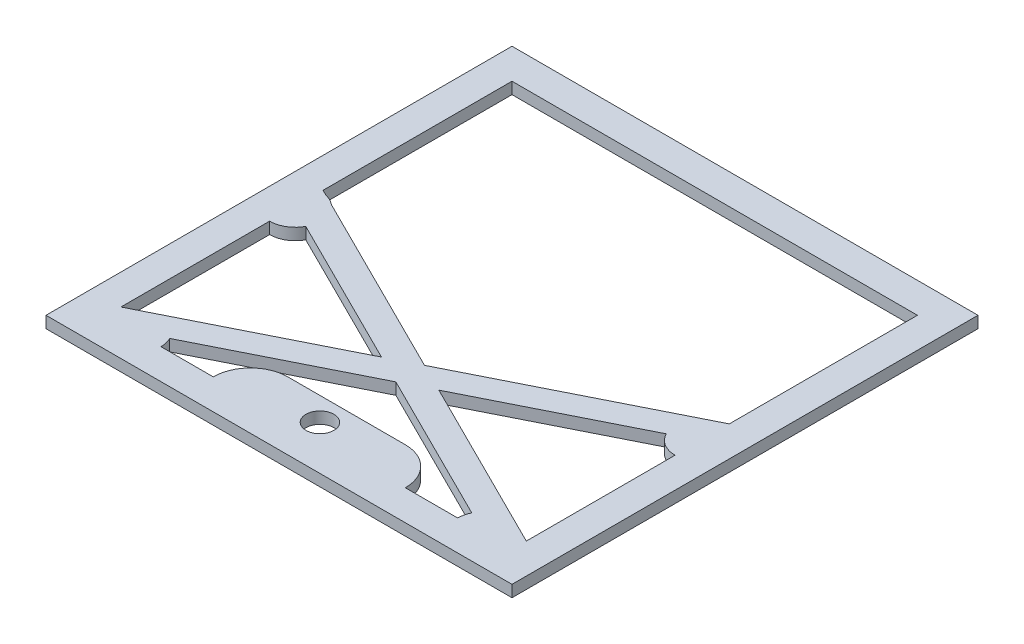
ISO-10303-21;
HEADER;
FILE_DESCRIPTION(('STEP AP214'),'2;1');
FILE_NAME('part.step','',(''),(''),'','','');
FILE_SCHEMA(('AUTOMOTIVE_DESIGN { 1 0 10303 214 1 1 1 1 }'));
ENDSEC;
DATA;
#1=APPLICATION_CONTEXT('core data for automotive mechanical design processes');
#2=APPLICATION_PROTOCOL_DEFINITION('international standard','automotive_design',2000,#1);
#3=PRODUCT_CONTEXT('',#1,'mechanical');
#4=PRODUCT('Part','Part','',(#3));
#5=PRODUCT_RELATED_PRODUCT_CATEGORY('part','',(#4));
#6=PRODUCT_DEFINITION_FORMATION('','',#4);
#7=PRODUCT_DEFINITION_CONTEXT('part definition',#1,'design');
#8=PRODUCT_DEFINITION('design','',#6,#7);
#9=PRODUCT_DEFINITION_SHAPE('','',#8);
#10=(LENGTH_UNIT() NAMED_UNIT(*) SI_UNIT(.MILLI.,.METRE.));
#11=(NAMED_UNIT(*) PLANE_ANGLE_UNIT() SI_UNIT($,.RADIAN.));
#12=(NAMED_UNIT(*) SI_UNIT($,.STERADIAN.) SOLID_ANGLE_UNIT());
#13=UNCERTAINTY_MEASURE_WITH_UNIT(LENGTH_MEASURE(1.E-05),#10,'distance_accuracy_value','');
#14=(GEOMETRIC_REPRESENTATION_CONTEXT(3) GLOBAL_UNCERTAINTY_ASSIGNED_CONTEXT((#13)) GLOBAL_UNIT_ASSIGNED_CONTEXT((#10,
#11,#12)) REPRESENTATION_CONTEXT('',''));
#15=CARTESIAN_POINT('',(0.,0.,0.));
#16=DIRECTION('',(0.,0.,1.));
#17=DIRECTION('',(1.,0.,0.));
#18=AXIS2_PLACEMENT_3D('',#15,#16,#17);
#19=CARTESIAN_POINT('',(44.7272034323035,0.,41.0390100090121));
#20=DIRECTION('',(0.446255793564874,0.,-0.894905451268336));
#21=DIRECTION('',(-0.894905451268336,0.,-0.446255793564874));
#22=AXIS2_PLACEMENT_3D('',#19,#20,#21);
#23=PLANE('',#22);
#24=DIRECTION('',(0.,1.,0.));
#25=VECTOR('',#24,1.);
#26=CARTESIAN_POINT('',(-42.2661730507299,0.,-2.34132497755329));
#27=LINE('',#26,#25);
#28=CARTESIAN_POINT('',(-42.2661730507299,0.,-2.34132497755329));
#29=VERTEX_POINT('',#28);
#30=CARTESIAN_POINT('',(-42.2661730507299,2.5,-2.3413249775533));
#31=VERTEX_POINT('',#30);
#32=EDGE_CURVE('E12',#29,#31,#27,.T.);
#33=ORIENTED_EDGE('',*,*,#32,.F.);
#34=DIRECTION('',(-0.894905451268336,0.,-0.446255793564874));
#35=VECTOR('',#34,1.);
#36=CARTESIAN_POINT('',(44.7272034323035,0.,41.0390100090121));
#37=LINE('',#36,#35);
#38=CARTESIAN_POINT('',(-43.5000000000001,0.,-2.95658821411972));
#39=VERTEX_POINT('',#38);
#40=EDGE_CURVE('E292',#29,#39,#37,.T.);
#41=ORIENTED_EDGE('',*,*,#40,.T.);
#42=DIRECTION('',(0.,1.,0.));
#43=VECTOR('',#42,1.);
#44=CARTESIAN_POINT('',(-43.5000000000001,2.5,-2.95658821411972));
#45=LINE('',#44,#43);
#46=CARTESIAN_POINT('',(-43.5000000000001,2.5,-2.95658821411972));
#47=VERTEX_POINT('',#46);
#48=EDGE_CURVE('E449',#39,#47,#45,.T.);
#49=ORIENTED_EDGE('',*,*,#48,.T.);
#50=DIRECTION('',(-0.894905451268336,0.,-0.446255793564874));
#51=VECTOR('',#50,1.);
#52=CARTESIAN_POINT('',(44.7272034323035,2.5,41.0390100090121));
#53=LINE('',#52,#51);
#54=EDGE_CURVE('E278',#31,#47,#53,.T.);
#55=ORIENTED_EDGE('',*,*,#54,.F.);
#56=EDGE_LOOP('',(#33,#41,#49,#55));
#57=FACE_BOUND('',#56,.T.);
#58=ADVANCED_FACE('F67',(#57),#23,.T.);
#59=CARTESIAN_POINT('',(43.5000000000001,2.5,43.5));
#60=DIRECTION('',(-1.,0.,0.));
#61=DIRECTION('',(0.,0.,1.));
#62=AXIS2_PLACEMENT_3D('',#59,#60,#61);
#63=PLANE('',#62);
#64=DIRECTION('',(0.,0.,-1.));
#65=VECTOR('',#64,1.);
#66=CARTESIAN_POINT('',(43.5000000000001,0.,43.5));
#67=LINE('',#66,#65);
#68=CARTESIAN_POINT('',(43.5000000000001,0.,-3.13230147297346));
#69=VERTEX_POINT('',#68);
#70=CARTESIAN_POINT('',(43.5000000000001,0.,-43.5));
#71=VERTEX_POINT('',#70);
#72=EDGE_CURVE('E357',#69,#71,#67,.T.);
#73=ORIENTED_EDGE('',*,*,#72,.F.);
#74=DIRECTION('',(0.,1.,0.));
#75=VECTOR('',#74,1.);
#76=CARTESIAN_POINT('',(43.5000000000001,2.5,-3.13230147297346));
#77=LINE('',#76,#75);
#78=CARTESIAN_POINT('',(43.5000000000001,2.5,-3.13230147297346));
#79=VERTEX_POINT('',#78);
#80=EDGE_CURVE('E459',#69,#79,#77,.T.);
#81=ORIENTED_EDGE('',*,*,#80,.T.);
#82=DIRECTION('',(0.,0.,-1.));
#83=VECTOR('',#82,1.);
#84=CARTESIAN_POINT('',(43.5000000000001,2.5,43.5));
#85=LINE('',#84,#83);
#86=CARTESIAN_POINT('',(43.5000000000001,2.5,-43.5));
#87=VERTEX_POINT('',#86);
#88=EDGE_CURVE('E361',#79,#87,#85,.T.);
#89=ORIENTED_EDGE('',*,*,#88,.T.);
#90=DIRECTION('',(0.,-1.,0.));
#91=VECTOR('',#90,1.);
#92=CARTESIAN_POINT('',(43.5000000000001,2.5,-43.5));
#93=LINE('',#92,#91);
#94=EDGE_CURVE('E395',#87,#71,#93,.T.);
#95=ORIENTED_EDGE('',*,*,#94,.T.);
#96=EDGE_LOOP('',(#73,#81,#89,#95));
#97=FACE_BOUND('',#96,.T.);
#98=ADVANCED_FACE('F535',(#97),#63,.T.);
#99=CARTESIAN_POINT('',(-43.5000000000001,2.5,43.5));
#100=DIRECTION('',(1.,0.,0.));
#101=DIRECTION('',(0.,0.,-1.));
#102=AXIS2_PLACEMENT_3D('',#99,#100,#101);
#103=PLANE('',#102);
#104=DIRECTION('',(0.,1.,0.));
#105=VECTOR('',#104,1.);
#106=CARTESIAN_POINT('',(-43.5000000000001,0.,8.51849508092393));
#107=LINE('',#106,#105);
#108=CARTESIAN_POINT('',(-43.5000000000001,2.5,8.51849508092393));
#109=VERTEX_POINT('',#108);
#110=CARTESIAN_POINT('',(-43.5000000000001,0.,8.51849508092393));
#111=VERTEX_POINT('',#110);
#112=EDGE_CURVE('E83',#109,#111,#107,.F.);
#113=ORIENTED_EDGE('',*,*,#112,.F.);
#114=DIRECTION('',(0.,0.,1.));
#115=VECTOR('',#114,1.);
#116=CARTESIAN_POINT('',(-43.5000000000001,2.5,43.5));
#117=LINE('',#116,#115);
#118=CARTESIAN_POINT('',(-43.5000000000001,2.5,40.4246017230513));
#119=VERTEX_POINT('',#118);
#120=EDGE_CURVE('E369',#109,#119,#117,.T.);
#121=ORIENTED_EDGE('',*,*,#120,.T.);
#122=DIRECTION('',(0.,-1.,0.));
#123=VECTOR('',#122,1.);
#124=CARTESIAN_POINT('',(-43.5000000000001,2.5,40.4246017230513));
#125=LINE('',#124,#123);
#126=CARTESIAN_POINT('',(-43.5000000000001,0.,40.4246017230513));
#127=VERTEX_POINT('',#126);
#128=EDGE_CURVE('E453',#119,#127,#125,.T.);
#129=ORIENTED_EDGE('',*,*,#128,.T.);
#130=DIRECTION('',(0.,0.,1.));
#131=VECTOR('',#130,1.);
#132=CARTESIAN_POINT('',(-43.5000000000001,0.,43.5));
#133=LINE('',#132,#131);
#134=EDGE_CURVE('E88',#111,#127,#133,.T.);
#135=ORIENTED_EDGE('',*,*,#134,.F.);
#136=EDGE_LOOP('',(#113,#121,#129,#135));
#137=FACE_BOUND('',#136,.T.);
#138=ADVANCED_FACE('F635',(#137),#103,.T.);
#139=CARTESIAN_POINT('',(-43.5000000000001,2.5,43.5));
#140=DIRECTION('',(0.,0.,-1.));
#141=DIRECTION('',(-1.,0.,0.));
#142=AXIS2_PLACEMENT_3D('',#139,#140,#141);
#143=PLANE('',#142);
#144=DIRECTION('',(0.,1.,0.));
#145=VECTOR('',#144,1.);
#146=CARTESIAN_POINT('',(31.8376150188844,0.,43.5));
#147=LINE('',#146,#145);
#148=CARTESIAN_POINT('',(31.8376150188844,0.,43.5));
#149=VERTEX_POINT('',#148);
#150=CARTESIAN_POINT('',(31.8376150188844,2.5,43.5));
#151=VERTEX_POINT('',#150);
#152=EDGE_CURVE('E283',#149,#151,#147,.T.);
#153=ORIENTED_EDGE('',*,*,#152,.F.);
#154=DIRECTION('',(1.,0.,0.));
#155=VECTOR('',#154,1.);
#156=CARTESIAN_POINT('',(-43.5000000000001,0.,43.5));
#157=LINE('',#156,#155);
#158=CARTESIAN_POINT('',(20.6151371181737,0.,43.5));
#159=VERTEX_POINT('',#158);
#160=EDGE_CURVE('E390',#159,#149,#157,.T.);
#161=ORIENTED_EDGE('',*,*,#160,.F.);
#162=DIRECTION('',(0.,1.,0.));
#163=VECTOR('',#162,1.);
#164=CARTESIAN_POINT('',(20.6151371181737,0.,43.5));
#165=LINE('',#164,#163);
#166=CARTESIAN_POINT('',(20.6151371181737,2.5,43.5));
#167=VERTEX_POINT('',#166);
#168=EDGE_CURVE('E441',#167,#159,#165,.F.);
#169=ORIENTED_EDGE('',*,*,#168,.F.);
#170=DIRECTION('',(1.,0.,0.));
#171=VECTOR('',#170,1.);
#172=CARTESIAN_POINT('',(-43.5000000000001,2.5,43.5));
#173=LINE('',#172,#171);
#174=EDGE_CURVE('E374',#167,#151,#173,.T.);
#175=ORIENTED_EDGE('',*,*,#174,.T.);
#176=EDGE_LOOP('',(#153,#161,#169,#175));
#177=FACE_BOUND('',#176,.T.);
#178=ADVANCED_FACE('F587',(#177),#143,.T.);
#179=DIRECTION('',(0.,1.,0.));
#180=VECTOR('',#179,1.);
#181=CARTESIAN_POINT('',(-31.8376150188844,0.,43.5));
#182=LINE('',#181,#180);
#183=CARTESIAN_POINT('',(-31.8376150188844,2.5,43.5));
#184=VERTEX_POINT('',#183);
#185=CARTESIAN_POINT('',(-31.8376150188844,0.,43.5));
#186=VERTEX_POINT('',#185);
#187=EDGE_CURVE('E569',#184,#186,#182,.F.);
#188=ORIENTED_EDGE('',*,*,#187,.F.);
#189=CARTESIAN_POINT('',(-20.6151371181738,2.5,43.5));
#190=VERTEX_POINT('',#189);
#191=EDGE_CURVE('E375',#184,#190,#173,.T.);
#192=ORIENTED_EDGE('',*,*,#191,.T.);
#193=DIRECTION('',(0.,1.,0.));
#194=VECTOR('',#193,1.);
#195=CARTESIAN_POINT('',(-20.6151371181738,0.,43.5));
#196=LINE('',#195,#194);
#197=CARTESIAN_POINT('',(-20.6151371181738,0.,43.5));
#198=VERTEX_POINT('',#197);
#199=EDGE_CURVE('E445',#198,#190,#196,.T.);
#200=ORIENTED_EDGE('',*,*,#199,.F.);
#201=EDGE_CURVE('E365',#186,#198,#157,.T.);
#202=ORIENTED_EDGE('',*,*,#201,.F.);
#203=EDGE_LOOP('',(#188,#192,#200,#202));
#204=FACE_BOUND('',#203,.T.);
#205=ADVANCED_FACE('F601',(#204),#143,.T.);
#206=CARTESIAN_POINT('',(0.,2.5,0.));
#207=DIRECTION('',(0.,-1.,0.));
#208=DIRECTION('',(0.,0.,-1.));
#209=AXIS2_PLACEMENT_3D('',#206,#207,#208);
#210=PLANE('',#209);
#211=ORIENTED_EDGE('',*,*,#120,.F.);
#212=CARTESIAN_POINT('',(-43.5000000000001,2.5,3.01849508092393));
#213=DIRECTION('',(0.,1.,0.));
#214=DIRECTION('',(0.,0.,-1.));
#215=AXIS2_PLACEMENT_3D('',#212,#213,#214);
#216=CIRCLE('',#215,5.5);
#217=CARTESIAN_POINT('',(-38.6481385406084,2.5,5.60875382839877));
#218=VERTEX_POINT('',#217);
#219=EDGE_CURVE('E258',#109,#218,#216,.T.);
#220=ORIENTED_EDGE('',*,*,#219,.T.);
#221=DIRECTION('',(-0.894905451268336,0.,-0.446255793564874));
#222=VECTOR('',#221,1.);
#223=CARTESIAN_POINT('',(42.2727965676967,2.5,45.9609899909879));
#224=LINE('',#223,#222);
#225=CARTESIAN_POINT('',(-6.23924538378793,2.5,21.7698536560492));
#226=VERTEX_POINT('',#225);
#227=EDGE_CURVE('E282',#226,#218,#224,.T.);
#228=ORIENTED_EDGE('',*,*,#227,.F.);
#229=DIRECTION('',(0.894193126338244,0.,-0.447681418878914));
#230=VECTOR('',#229,1.);
#231=CARTESIAN_POINT('',(-44.7311239019171,2.5,41.0409689025698));
#232=LINE('',#231,#230);
#233=EDGE_CURVE('E321',#119,#226,#232,.T.);
#234=ORIENTED_EDGE('',*,*,#233,.F.);
#235=EDGE_LOOP('',(#211,#220,#228,#234));
#236=FACE_BOUND('',#235,.T.);
#237=ORIENTED_EDGE('',*,*,#191,.F.);
#238=CARTESIAN_POINT('',(-37.3376150188845,2.5,43.5));
#239=DIRECTION('',(0.,1.,0.));
#240=DIRECTION('',(0.,0.,-1.));
#241=AXIS2_PLACEMENT_3D('',#238,#239,#240);
#242=CIRCLE('',#241,5.50000000000001);
#243=CARTESIAN_POINT('',(-32.4234920921566,2.5,41.0298996253172));
#244=VERTEX_POINT('',#243);
#245=EDGE_CURVE('E473',#184,#244,#242,.T.);
#246=ORIENTED_EDGE('',*,*,#245,.T.);
#247=DIRECTION('',(0.894193126338244,0.,-0.447681418878914));
#248=VECTOR('',#247,1.);
#249=CARTESIAN_POINT('',(-42.2688760980831,2.5,45.9590310974302));
#250=LINE('',#249,#248);
#251=CARTESIAN_POINT('',(-0.0842422801904177,2.5,24.8391229185141));
#252=VERTEX_POINT('',#251);
#253=EDGE_CURVE('E318',#244,#252,#250,.T.);
#254=ORIENTED_EDGE('',*,*,#253,.T.);
#255=CARTESIAN_POINT('',(32.4156350369086,2.5,41.0455931353932));
#256=VERTEX_POINT('',#255);
#257=EDGE_CURVE('E288',#256,#252,#224,.T.);
#258=ORIENTED_EDGE('',*,*,#257,.F.);
#259=CARTESIAN_POINT('',(37.3376150188845,2.5,43.5));
#260=DIRECTION('',(0.,1.,0.));
#261=DIRECTION('',(0.,0.,1.));
#262=AXIS2_PLACEMENT_3D('',#259,#260,#261);
#263=CIRCLE('',#262,5.50000000000001);
#264=EDGE_CURVE('E494',#256,#151,#263,.T.);
#265=ORIENTED_EDGE('',*,*,#264,.T.);
#266=ORIENTED_EDGE('',*,*,#174,.F.);
#267=CARTESIAN_POINT('',(12.6151371181737,2.5,43.5));
#268=DIRECTION('',(0.,1.,0.));
#269=DIRECTION('',(0.,0.,1.));
#270=AXIS2_PLACEMENT_3D('',#267,#268,#269);
#271=CIRCLE('',#270,8.);
#272=CARTESIAN_POINT('',(12.6151371181738,2.5,35.5));
#273=VERTEX_POINT('',#272);
#274=EDGE_CURVE('E348',#167,#273,#271,.T.);
#275=ORIENTED_EDGE('',*,*,#274,.T.);
#276=DIRECTION('',(-1.,0.,0.));
#277=VECTOR('',#276,1.);
#278=CARTESIAN_POINT('',(-12.6151371181738,2.5,35.5));
#279=LINE('',#278,#277);
#280=CARTESIAN_POINT('',(-12.6151371181738,2.5,35.5));
#281=VERTEX_POINT('',#280);
#282=EDGE_CURVE('E337',#273,#281,#279,.T.);
#283=ORIENTED_EDGE('',*,*,#282,.T.);
#284=CARTESIAN_POINT('',(-12.6151371181738,2.5,43.5));
#285=DIRECTION('',(0.,1.,0.));
#286=DIRECTION('',(0.,0.,1.));
#287=AXIS2_PLACEMENT_3D('',#284,#285,#286);
#288=CIRCLE('',#287,8.);
#289=EDGE_CURVE('E328',#281,#190,#288,.T.);
#290=ORIENTED_EDGE('',*,*,#289,.T.);
#291=EDGE_LOOP('',(#237,#246,#254,#258,#265,#266,#275,#283,#290));
#292=FACE_BOUND('',#291,.T.);
#293=CARTESIAN_POINT('',(6.06586157718027,2.5,21.7600484545946));
#294=VERTEX_POINT('',#293);
#295=CARTESIAN_POINT('',(38.5819378051397,2.5,5.48074288475796));
#296=VERTEX_POINT('',#295);
#297=EDGE_CURVE('E308',#294,#296,#250,.T.);
#298=ORIENTED_EDGE('',*,*,#297,.T.);
#299=CARTESIAN_POINT('',(43.5000000000001,2.5,3.01849508092393));
#300=DIRECTION('',(0.,1.,0.));
#301=DIRECTION('',(0.,0.,1.));
#302=AXIS2_PLACEMENT_3D('',#299,#300,#301);
#303=CIRCLE('',#302,5.5);
#304=CARTESIAN_POINT('',(43.5000000000001,2.5,8.51849508092393));
#305=VERTEX_POINT('',#304);
#306=EDGE_CURVE('E568',#296,#305,#303,.T.);
#307=ORIENTED_EDGE('',*,*,#306,.T.);
#308=CARTESIAN_POINT('',(43.5000000000001,2.5,40.4270496720045));
#309=VERTEX_POINT('',#308);
#310=EDGE_CURVE('E364',#309,#305,#85,.T.);
#311=ORIENTED_EDGE('',*,*,#310,.F.);
#312=EDGE_CURVE('E277',#309,#294,#53,.T.);
#313=ORIENTED_EDGE('',*,*,#312,.T.);
#314=EDGE_LOOP('',(#298,#307,#311,#313));
#315=FACE_BOUND('',#314,.T.);
#316=CARTESIAN_POINT('',(-0.0891415264172302,2.5,18.6907791921297));
#317=VERTEX_POINT('',#316);
#318=CARTESIAN_POINT('',(-39.9614473496563,2.5,-1.19204468741283));
#319=VERTEX_POINT('',#318);
#320=EDGE_CURVE('E266',#317,#319,#53,.T.);
#321=ORIENTED_EDGE('',*,*,#320,.T.);
#322=EDGE_CURVE('E249',#319,#31,#216,.T.);
#323=ORIENTED_EDGE('',*,*,#322,.T.);
#324=ORIENTED_EDGE('',*,*,#54,.T.);
#325=CARTESIAN_POINT('',(-43.5000000000001,2.5,-43.5));
#326=VERTEX_POINT('',#325);
#327=EDGE_CURVE('E370',#326,#47,#117,.T.);
#328=ORIENTED_EDGE('',*,*,#327,.F.);
#329=DIRECTION('',(-1.,0.,0.));
#330=VECTOR('',#329,1.);
#331=CARTESIAN_POINT('',(-43.5000000000001,2.5,-43.5));
#332=LINE('',#331,#330);
#333=EDGE_CURVE('E366',#87,#326,#332,.T.);
#334=ORIENTED_EDGE('',*,*,#333,.F.);
#335=ORIENTED_EDGE('',*,*,#88,.F.);
#336=EDGE_CURVE('E274',#317,#79,#232,.T.);
#337=ORIENTED_EDGE('',*,*,#336,.F.);
#338=EDGE_LOOP('',(#321,#323,#324,#328,#334,#335,#337));
#339=FACE_BOUND('',#338,.T.);
#340=DIRECTION('',(1.,0.,0.));
#341=VECTOR('',#340,1.);
#342=CARTESIAN_POINT('',(-50.,2.5,50.));
#343=LINE('',#342,#341);
#344=CARTESIAN_POINT('',(-50.,2.5,50.));
#345=VERTEX_POINT('',#344);
#346=CARTESIAN_POINT('',(50.,2.5,50.));
#347=VERTEX_POINT('',#346);
#348=EDGE_CURVE('E411',#345,#347,#343,.T.);
#349=ORIENTED_EDGE('',*,*,#348,.T.);
#350=DIRECTION('',(0.,0.,-1.));
#351=VECTOR('',#350,1.);
#352=CARTESIAN_POINT('',(50.,2.5,50.));
#353=LINE('',#352,#351);
#354=CARTESIAN_POINT('',(50.,2.5,-50.));
#355=VERTEX_POINT('',#354);
#356=EDGE_CURVE('E400',#347,#355,#353,.T.);
#357=ORIENTED_EDGE('',*,*,#356,.T.);
#358=DIRECTION('',(-1.,0.,0.));
#359=VECTOR('',#358,1.);
#360=CARTESIAN_POINT('',(-50.,2.5,-50.));
#361=LINE('',#360,#359);
#362=CARTESIAN_POINT('',(-50.,2.5,-50.));
#363=VERTEX_POINT('',#362);
#364=EDGE_CURVE('E404',#355,#363,#361,.T.);
#365=ORIENTED_EDGE('',*,*,#364,.T.);
#366=DIRECTION('',(0.,0.,1.));
#367=VECTOR('',#366,1.);
#368=CARTESIAN_POINT('',(-50.,2.5,50.));
#369=LINE('',#368,#367);
#370=EDGE_CURVE('E408',#363,#345,#369,.T.);
#371=ORIENTED_EDGE('',*,*,#370,.T.);
#372=EDGE_LOOP('',(#349,#357,#365,#371));
#373=FACE_BOUND('',#372,.T.);
#374=CARTESIAN_POINT('',(-0.710916126079611,2.5,40.5));
#375=DIRECTION('',(0.,1.,0.));
#376=DIRECTION('',(0.,0.,1.));
#377=AXIS2_PLACEMENT_3D('',#374,#375,#376);
#378=CIRCLE('',#377,3.);
#379=CARTESIAN_POINT('',(-0.710916126079611,2.5,43.5));
#380=VERTEX_POINT('',#379);
#381=EDGE_CURVE('E317',#380,#380,#378,.T.);
#382=ORIENTED_EDGE('',*,*,#381,.F.);
#383=EDGE_LOOP('',(#382));
#384=FACE_BOUND('',#383,.T.);
#385=ADVANCED_FACE('F271',(#236,#292,#315,#339,#373,#384),#210,.F.);
#386=CARTESIAN_POINT('',(0.,0.,0.));
#387=DIRECTION('',(0.,-1.,0.));
#388=DIRECTION('',(0.,0.,-1.));
#389=AXIS2_PLACEMENT_3D('',#386,#387,#388);
#390=PLANE('',#389);
#391=CARTESIAN_POINT('',(-43.5000000000001,0.,3.01849508092393));
#392=DIRECTION('',(0.,1.,0.));
#393=DIRECTION('',(0.,0.,-1.));
#394=AXIS2_PLACEMENT_3D('',#391,#392,#393);
#395=CIRCLE('',#394,5.5);
#396=CARTESIAN_POINT('',(-38.6481385406084,0.,5.60875382839877));
#397=VERTEX_POINT('',#396);
#398=EDGE_CURVE('E259',#111,#397,#395,.T.);
#399=ORIENTED_EDGE('',*,*,#398,.F.);
#400=ORIENTED_EDGE('',*,*,#134,.T.);
#401=DIRECTION('',(0.894193126338244,0.,-0.447681418878914));
#402=VECTOR('',#401,1.);
#403=CARTESIAN_POINT('',(-44.7311239019171,0.,41.0409689025698));
#404=LINE('',#403,#402);
#405=CARTESIAN_POINT('',(-6.23924538378793,0.,21.7698536560492));
#406=VERTEX_POINT('',#405);
#407=EDGE_CURVE('E314',#127,#406,#404,.T.);
#408=ORIENTED_EDGE('',*,*,#407,.T.);
#409=DIRECTION('',(-0.894905451268336,0.,-0.446255793564874));
#410=VECTOR('',#409,1.);
#411=CARTESIAN_POINT('',(42.2727965676967,0.,45.9609899909879));
#412=LINE('',#411,#410);
#413=EDGE_CURVE('E509',#406,#397,#412,.T.);
#414=ORIENTED_EDGE('',*,*,#413,.T.);
#415=EDGE_LOOP('',(#399,#400,#408,#414));
#416=FACE_BOUND('',#415,.T.);
#417=CARTESIAN_POINT('',(-39.9614473496563,0.,-1.19204468741283));
#418=VERTEX_POINT('',#417);
#419=EDGE_CURVE('E615',#418,#29,#395,.T.);
#420=ORIENTED_EDGE('',*,*,#419,.F.);
#421=CARTESIAN_POINT('',(-0.0891415264172302,0.,18.6907791921297));
#422=VERTEX_POINT('',#421);
#423=EDGE_CURVE('E268',#422,#418,#37,.T.);
#424=ORIENTED_EDGE('',*,*,#423,.F.);
#425=EDGE_CURVE('E312',#422,#69,#404,.T.);
#426=ORIENTED_EDGE('',*,*,#425,.T.);
#427=ORIENTED_EDGE('',*,*,#72,.T.);
#428=DIRECTION('',(-1.,0.,0.));
#429=VECTOR('',#428,1.);
#430=CARTESIAN_POINT('',(-43.5000000000001,0.,-43.5));
#431=LINE('',#430,#429);
#432=CARTESIAN_POINT('',(-43.5000000000001,0.,-43.5));
#433=VERTEX_POINT('',#432);
#434=EDGE_CURVE('E382',#71,#433,#431,.T.);
#435=ORIENTED_EDGE('',*,*,#434,.T.);
#436=EDGE_CURVE('E386',#433,#39,#133,.T.);
#437=ORIENTED_EDGE('',*,*,#436,.T.);
#438=ORIENTED_EDGE('',*,*,#40,.F.);
#439=EDGE_LOOP('',(#420,#424,#426,#427,#435,#437,#438));
#440=FACE_BOUND('',#439,.T.);
#441=CARTESIAN_POINT('',(-37.3376150188845,0.,43.5));
#442=DIRECTION('',(0.,1.,0.));
#443=DIRECTION('',(0.,0.,-1.));
#444=AXIS2_PLACEMENT_3D('',#441,#442,#443);
#445=CIRCLE('',#444,5.50000000000001);
#446=CARTESIAN_POINT('',(-32.4234920921566,0.,41.0298996253172));
#447=VERTEX_POINT('',#446);
#448=EDGE_CURVE('E476',#186,#447,#445,.T.);
#449=ORIENTED_EDGE('',*,*,#448,.F.);
#450=ORIENTED_EDGE('',*,*,#201,.T.);
#451=CARTESIAN_POINT('',(-12.6151371181738,0.,43.5));
#452=DIRECTION('',(0.,1.,0.));
#453=DIRECTION('',(0.,0.,1.));
#454=AXIS2_PLACEMENT_3D('',#451,#452,#453);
#455=CIRCLE('',#454,8.);
#456=CARTESIAN_POINT('',(-12.6151371181738,0.,35.5));
#457=VERTEX_POINT('',#456);
#458=EDGE_CURVE('E332',#457,#198,#455,.T.);
#459=ORIENTED_EDGE('',*,*,#458,.F.);
#460=DIRECTION('',(-1.,0.,0.));
#461=VECTOR('',#460,1.);
#462=CARTESIAN_POINT('',(-12.6151371181738,0.,35.5));
#463=LINE('',#462,#461);
#464=CARTESIAN_POINT('',(12.6151371181738,0.,35.5));
#465=VERTEX_POINT('',#464);
#466=EDGE_CURVE('E340',#465,#457,#463,.T.);
#467=ORIENTED_EDGE('',*,*,#466,.F.);
#468=CARTESIAN_POINT('',(12.6151371181737,0.,43.5));
#469=DIRECTION('',(0.,1.,0.));
#470=DIRECTION('',(0.,0.,1.));
#471=AXIS2_PLACEMENT_3D('',#468,#469,#470);
#472=CIRCLE('',#471,8.);
#473=EDGE_CURVE('E336',#159,#465,#472,.T.);
#474=ORIENTED_EDGE('',*,*,#473,.F.);
#475=ORIENTED_EDGE('',*,*,#160,.T.);
#476=CARTESIAN_POINT('',(37.3376150188845,0.,43.5));
#477=DIRECTION('',(0.,1.,0.));
#478=DIRECTION('',(0.,0.,1.));
#479=AXIS2_PLACEMENT_3D('',#476,#477,#478);
#480=CIRCLE('',#479,5.50000000000001);
#481=CARTESIAN_POINT('',(32.4156350369086,0.,41.0455931353932));
#482=VERTEX_POINT('',#481);
#483=EDGE_CURVE('E497',#482,#149,#480,.T.);
#484=ORIENTED_EDGE('',*,*,#483,.F.);
#485=CARTESIAN_POINT('',(-0.0842422801904177,0.,24.8391229185141));
#486=VERTEX_POINT('',#485);
#487=EDGE_CURVE('E286',#482,#486,#412,.T.);
#488=ORIENTED_EDGE('',*,*,#487,.T.);
#489=DIRECTION('',(0.894193126338244,0.,-0.447681418878914));
#490=VECTOR('',#489,1.);
#491=CARTESIAN_POINT('',(-42.2688760980831,0.,45.9590310974302));
#492=LINE('',#491,#490);
#493=EDGE_CURVE('E309',#447,#486,#492,.T.);
#494=ORIENTED_EDGE('',*,*,#493,.F.);
#495=EDGE_LOOP('',(#449,#450,#459,#467,#474,#475,#484,#488,#494));
#496=FACE_BOUND('',#495,.T.);
#497=CARTESIAN_POINT('',(43.5000000000001,0.,3.01849508092393));
#498=DIRECTION('',(0.,1.,0.));
#499=DIRECTION('',(0.,0.,1.));
#500=AXIS2_PLACEMENT_3D('',#497,#498,#499);
#501=CIRCLE('',#500,5.5);
#502=CARTESIAN_POINT('',(38.5819378051397,0.,5.48074288475796));
#503=VERTEX_POINT('',#502);
#504=CARTESIAN_POINT('',(43.5000000000001,0.,8.51849508092393));
#505=VERTEX_POINT('',#504);
#506=EDGE_CURVE('E564',#503,#505,#501,.T.);
#507=ORIENTED_EDGE('',*,*,#506,.F.);
#508=CARTESIAN_POINT('',(6.06586157718027,0.,21.7600484545946));
#509=VERTEX_POINT('',#508);
#510=EDGE_CURVE('E313',#509,#503,#492,.T.);
#511=ORIENTED_EDGE('',*,*,#510,.F.);
#512=CARTESIAN_POINT('',(43.5000000000001,0.,40.4270496720045));
#513=VERTEX_POINT('',#512);
#514=EDGE_CURVE('E507',#513,#509,#37,.T.);
#515=ORIENTED_EDGE('',*,*,#514,.F.);
#516=EDGE_CURVE('E381',#513,#505,#67,.T.);
#517=ORIENTED_EDGE('',*,*,#516,.T.);
#518=EDGE_LOOP('',(#507,#511,#515,#517));
#519=FACE_BOUND('',#518,.T.);
#520=CARTESIAN_POINT('',(-0.710916126079611,0.,40.5));
#521=DIRECTION('',(0.,1.,0.));
#522=DIRECTION('',(0.,0.,1.));
#523=AXIS2_PLACEMENT_3D('',#520,#521,#522);
#524=CIRCLE('',#523,3.);
#525=CARTESIAN_POINT('',(-0.710916126079611,0.,43.5));
#526=VERTEX_POINT('',#525);
#527=EDGE_CURVE('E324',#526,#526,#524,.T.);
#528=ORIENTED_EDGE('',*,*,#527,.T.);
#529=EDGE_LOOP('',(#528));
#530=FACE_BOUND('',#529,.T.);
#531=DIRECTION('',(0.,0.,-1.));
#532=VECTOR('',#531,1.);
#533=CARTESIAN_POINT('',(50.,0.,50.));
#534=LINE('',#533,#532);
#535=CARTESIAN_POINT('',(50.,0.,50.));
#536=VERTEX_POINT('',#535);
#537=CARTESIAN_POINT('',(50.,0.,-50.));
#538=VERTEX_POINT('',#537);
#539=EDGE_CURVE('E399',#536,#538,#534,.T.);
#540=ORIENTED_EDGE('',*,*,#539,.F.);
#541=DIRECTION('',(1.,0.,0.));
#542=VECTOR('',#541,1.);
#543=CARTESIAN_POINT('',(-50.,0.,50.));
#544=LINE('',#543,#542);
#545=CARTESIAN_POINT('',(-50.,0.,50.));
#546=VERTEX_POINT('',#545);
#547=EDGE_CURVE('E405',#546,#536,#544,.T.);
#548=ORIENTED_EDGE('',*,*,#547,.F.);
#549=DIRECTION('',(0.,0.,1.));
#550=VECTOR('',#549,1.);
#551=CARTESIAN_POINT('',(-50.,0.,50.));
#552=LINE('',#551,#550);
#553=CARTESIAN_POINT('',(-50.,0.,-50.));
#554=VERTEX_POINT('',#553);
#555=EDGE_CURVE('E421',#554,#546,#552,.T.);
#556=ORIENTED_EDGE('',*,*,#555,.F.);
#557=DIRECTION('',(-1.,0.,0.));
#558=VECTOR('',#557,1.);
#559=CARTESIAN_POINT('',(-50.,0.,-50.));
#560=LINE('',#559,#558);
#561=EDGE_CURVE('E418',#538,#554,#560,.T.);
#562=ORIENTED_EDGE('',*,*,#561,.F.);
#563=EDGE_LOOP('',(#540,#548,#556,#562));
#564=FACE_BOUND('',#563,.T.);
#565=ADVANCED_FACE('F526',(#416,#440,#496,#519,#530,#564),#390,.T.);
#566=CARTESIAN_POINT('',(50.,2.5,50.));
#567=DIRECTION('',(-1.,0.,0.));
#568=DIRECTION('',(0.,0.,1.));
#569=AXIS2_PLACEMENT_3D('',#566,#567,#568);
#570=PLANE('',#569);
#571=ORIENTED_EDGE('',*,*,#539,.T.);
#572=DIRECTION('',(0.,-1.,0.));
#573=VECTOR('',#572,1.);
#574=CARTESIAN_POINT('',(50.,2.5,-50.));
#575=LINE('',#574,#573);
#576=EDGE_CURVE('E437',#355,#538,#575,.T.);
#577=ORIENTED_EDGE('',*,*,#576,.F.);
#578=ORIENTED_EDGE('',*,*,#356,.F.);
#579=DIRECTION('',(0.,-1.,0.));
#580=VECTOR('',#579,1.);
#581=CARTESIAN_POINT('',(50.,2.5,50.));
#582=LINE('',#581,#580);
#583=EDGE_CURVE('E414',#347,#536,#582,.T.);
#584=ORIENTED_EDGE('',*,*,#583,.T.);
#585=EDGE_LOOP('',(#571,#577,#578,#584));
#586=FACE_BOUND('',#585,.T.);
#587=ADVANCED_FACE('F69',(#586),#570,.F.);
#588=CARTESIAN_POINT('',(-50.,2.5,-50.));
#589=DIRECTION('',(0.,0.,1.));
#590=DIRECTION('',(1.,0.,0.));
#591=AXIS2_PLACEMENT_3D('',#588,#589,#590);
#592=PLANE('',#591);
#593=ORIENTED_EDGE('',*,*,#561,.T.);
#594=DIRECTION('',(0.,-1.,0.));
#595=VECTOR('',#594,1.);
#596=CARTESIAN_POINT('',(-50.,2.5,-50.));
#597=LINE('',#596,#595);
#598=EDGE_CURVE('E433',#363,#554,#597,.T.);
#599=ORIENTED_EDGE('',*,*,#598,.F.);
#600=ORIENTED_EDGE('',*,*,#364,.F.);
#601=ORIENTED_EDGE('',*,*,#576,.T.);
#602=EDGE_LOOP('',(#593,#599,#600,#601));
#603=FACE_BOUND('',#602,.T.);
#604=ADVANCED_FACE('F932',(#603),#592,.F.);
#605=CARTESIAN_POINT('',(-50.,2.5,50.));
#606=DIRECTION('',(1.,0.,0.));
#607=DIRECTION('',(0.,0.,-1.));
#608=AXIS2_PLACEMENT_3D('',#605,#606,#607);
#609=PLANE('',#608);
#610=ORIENTED_EDGE('',*,*,#555,.T.);
#611=DIRECTION('',(0.,-1.,0.));
#612=VECTOR('',#611,1.);
#613=CARTESIAN_POINT('',(-50.,2.5,50.));
#614=LINE('',#613,#612);
#615=EDGE_CURVE('E429',#345,#546,#614,.T.);
#616=ORIENTED_EDGE('',*,*,#615,.F.);
#617=ORIENTED_EDGE('',*,*,#370,.F.);
#618=ORIENTED_EDGE('',*,*,#598,.T.);
#619=EDGE_LOOP('',(#610,#616,#617,#618));
#620=FACE_BOUND('',#619,.T.);
#621=ADVANCED_FACE('F918',(#620),#609,.F.);
#622=CARTESIAN_POINT('',(-50.,2.5,50.));
#623=DIRECTION('',(0.,0.,-1.));
#624=DIRECTION('',(-1.,0.,0.));
#625=AXIS2_PLACEMENT_3D('',#622,#623,#624);
#626=PLANE('',#625);
#627=ORIENTED_EDGE('',*,*,#583,.F.);
#628=ORIENTED_EDGE('',*,*,#348,.F.);
#629=ORIENTED_EDGE('',*,*,#615,.T.);
#630=ORIENTED_EDGE('',*,*,#547,.T.);
#631=EDGE_LOOP('',(#627,#628,#629,#630));
#632=FACE_BOUND('',#631,.T.);
#633=ADVANCED_FACE('F703',(#632),#626,.F.);
#634=DIRECTION('',(0.,1.,0.));
#635=VECTOR('',#634,1.);
#636=CARTESIAN_POINT('',(43.5000000000001,0.,8.51849508092393));
#637=LINE('',#636,#635);
#638=EDGE_CURVE('E498',#505,#305,#637,.T.);
#639=ORIENTED_EDGE('',*,*,#638,.F.);
#640=ORIENTED_EDGE('',*,*,#516,.F.);
#641=DIRECTION('',(0.,-1.,0.));
#642=VECTOR('',#641,1.);
#643=CARTESIAN_POINT('',(43.5000000000001,2.5,40.4270496720045));
#644=LINE('',#643,#642);
#645=EDGE_CURVE('E456',#309,#513,#644,.T.);
#646=ORIENTED_EDGE('',*,*,#645,.F.);
#647=ORIENTED_EDGE('',*,*,#310,.T.);
#648=EDGE_LOOP('',(#639,#640,#646,#647));
#649=FACE_BOUND('',#648,.T.);
#650=ADVANCED_FACE('F583',(#649),#63,.T.);
#651=CARTESIAN_POINT('',(-43.5000000000001,2.5,-43.5));
#652=DIRECTION('',(0.,0.,1.));
#653=DIRECTION('',(1.,0.,0.));
#654=AXIS2_PLACEMENT_3D('',#651,#652,#653);
#655=PLANE('',#654);
#656=ORIENTED_EDGE('',*,*,#434,.F.);
#657=ORIENTED_EDGE('',*,*,#94,.F.);
#658=ORIENTED_EDGE('',*,*,#333,.T.);
#659=DIRECTION('',(0.,-1.,0.));
#660=VECTOR('',#659,1.);
#661=CARTESIAN_POINT('',(-43.5000000000001,2.5,-43.5));
#662=LINE('',#661,#660);
#663=EDGE_CURVE('E378',#326,#433,#662,.T.);
#664=ORIENTED_EDGE('',*,*,#663,.T.);
#665=EDGE_LOOP('',(#656,#657,#658,#664));
#666=FACE_BOUND('',#665,.T.);
#667=ADVANCED_FACE('F532',(#666),#655,.T.);
#668=ORIENTED_EDGE('',*,*,#48,.F.);
#669=ORIENTED_EDGE('',*,*,#436,.F.);
#670=ORIENTED_EDGE('',*,*,#663,.F.);
#671=ORIENTED_EDGE('',*,*,#327,.T.);
#672=EDGE_LOOP('',(#668,#669,#670,#671));
#673=FACE_BOUND('',#672,.T.);
#674=ADVANCED_FACE('F523',(#673),#103,.T.);
#675=CARTESIAN_POINT('',(-12.6151371181738,0.,35.5));
#676=DIRECTION('',(0.,0.,-1.));
#677=DIRECTION('',(-1.,0.,0.));
#678=AXIS2_PLACEMENT_3D('',#675,#676,#677);
#679=PLANE('',#678);
#680=ORIENTED_EDGE('',*,*,#282,.F.);
#681=DIRECTION('',(0.,1.,0.));
#682=VECTOR('',#681,1.);
#683=CARTESIAN_POINT('',(12.6151371181738,0.,35.5));
#684=LINE('',#683,#682);
#685=EDGE_CURVE('E344',#465,#273,#684,.T.);
#686=ORIENTED_EDGE('',*,*,#685,.F.);
#687=ORIENTED_EDGE('',*,*,#466,.T.);
#688=DIRECTION('',(0.,1.,0.));
#689=VECTOR('',#688,1.);
#690=CARTESIAN_POINT('',(-12.6151371181738,0.,35.5));
#691=LINE('',#690,#689);
#692=EDGE_CURVE('E354',#457,#281,#691,.T.);
#693=ORIENTED_EDGE('',*,*,#692,.T.);
#694=EDGE_LOOP('',(#680,#686,#687,#693));
#695=FACE_BOUND('',#694,.T.);
#696=ADVANCED_FACE('F594',(#695),#679,.T.);
#697=CARTESIAN_POINT('',(12.6151371181737,0.,43.5));
#698=DIRECTION('',(0.,1.,0.));
#699=DIRECTION('',(0.,0.,1.));
#700=AXIS2_PLACEMENT_3D('',#697,#698,#699);
#701=CYLINDRICAL_SURFACE('',#700,8.);
#702=ORIENTED_EDGE('',*,*,#274,.F.);
#703=ORIENTED_EDGE('',*,*,#168,.T.);
#704=ORIENTED_EDGE('',*,*,#473,.T.);
#705=ORIENTED_EDGE('',*,*,#685,.T.);
#706=EDGE_LOOP('',(#702,#703,#704,#705));
#707=FACE_BOUND('',#706,.T.);
#708=ADVANCED_FACE('F592',(#707),#701,.T.);
#709=CARTESIAN_POINT('',(-12.6151371181738,0.,43.5));
#710=DIRECTION('',(0.,1.,0.));
#711=DIRECTION('',(0.,0.,1.));
#712=AXIS2_PLACEMENT_3D('',#709,#710,#711);
#713=CYLINDRICAL_SURFACE('',#712,8.);
#714=ORIENTED_EDGE('',*,*,#458,.T.);
#715=ORIENTED_EDGE('',*,*,#199,.T.);
#716=ORIENTED_EDGE('',*,*,#289,.F.);
#717=ORIENTED_EDGE('',*,*,#692,.F.);
#718=EDGE_LOOP('',(#714,#715,#716,#717));
#719=FACE_BOUND('',#718,.T.);
#720=ADVANCED_FACE('F598',(#719),#713,.T.);
#721=CARTESIAN_POINT('',(-0.710916126079611,0.,40.5));
#722=DIRECTION('',(0.,1.,0.));
#723=DIRECTION('',(0.,0.,1.));
#724=AXIS2_PLACEMENT_3D('',#721,#722,#723);
#725=CYLINDRICAL_SURFACE('',#724,3.);
#726=ORIENTED_EDGE('',*,*,#527,.F.);
#727=EDGE_LOOP('',(#726));
#728=FACE_BOUND('',#727,.T.);
#729=ORIENTED_EDGE('',*,*,#381,.T.);
#730=EDGE_LOOP('',(#729));
#731=FACE_BOUND('',#730,.T.);
#732=ADVANCED_FACE('F674',(#728,#731),#725,.F.);
#733=CARTESIAN_POINT('',(-42.2688760980831,0.,45.9590310974302));
#734=DIRECTION('',(0.447681418878914,0.,0.894193126338244));
#735=DIRECTION('',(0.894193126338244,0.,-0.447681418878914));
#736=AXIS2_PLACEMENT_3D('',#733,#734,#735);
#737=PLANE('',#736);
#738=DIRECTION('',(0.,1.,0.));
#739=VECTOR('',#738,1.);
#740=CARTESIAN_POINT('',(-32.4234920921566,0.,41.0298996253172));
#741=LINE('',#740,#739);
#742=EDGE_CURVE('E270',#447,#244,#741,.T.);
#743=ORIENTED_EDGE('',*,*,#742,.F.);
#744=ORIENTED_EDGE('',*,*,#493,.T.);
#745=DIRECTION('',(0.,1.,0.));
#746=VECTOR('',#745,1.);
#747=CARTESIAN_POINT('',(-0.0842422801904108,0.,24.8391229185141));
#748=LINE('',#747,#746);
#749=EDGE_CURVE('E297',#486,#252,#748,.T.);
#750=ORIENTED_EDGE('',*,*,#749,.T.);
#751=ORIENTED_EDGE('',*,*,#253,.F.);
#752=EDGE_LOOP('',(#743,#744,#750,#751));
#753=FACE_BOUND('',#752,.T.);
#754=ADVANCED_FACE('F479',(#753),#737,.T.);
#755=CARTESIAN_POINT('',(-44.7311239019171,0.,41.0409689025698));
#756=DIRECTION('',(0.447681418878914,0.,0.894193126338244));
#757=DIRECTION('',(0.894193126338244,0.,-0.447681418878914));
#758=AXIS2_PLACEMENT_3D('',#755,#756,#757);
#759=PLANE('',#758);
#760=ORIENTED_EDGE('',*,*,#128,.F.);
#761=ORIENTED_EDGE('',*,*,#233,.T.);
#762=DIRECTION('',(0.,1.,0.));
#763=VECTOR('',#762,1.);
#764=CARTESIAN_POINT('',(-6.23924538378792,0.,21.7698536560492));
#765=LINE('',#764,#763);
#766=EDGE_CURVE('E293',#406,#226,#765,.T.);
#767=ORIENTED_EDGE('',*,*,#766,.F.);
#768=ORIENTED_EDGE('',*,*,#407,.F.);
#769=EDGE_LOOP('',(#760,#761,#767,#768));
#770=FACE_BOUND('',#769,.T.);
#771=ADVANCED_FACE('F634',(#770),#759,.F.);
#772=DIRECTION('',(0.,1.,0.));
#773=VECTOR('',#772,1.);
#774=CARTESIAN_POINT('',(38.5819378051397,0.,5.48074288475796));
#775=LINE('',#774,#773);
#776=EDGE_CURVE('E503',#296,#503,#775,.F.);
#777=ORIENTED_EDGE('',*,*,#776,.F.);
#778=ORIENTED_EDGE('',*,*,#297,.F.);
#779=DIRECTION('',(0.,1.,0.));
#780=VECTOR('',#779,1.);
#781=CARTESIAN_POINT('',(6.06586157718027,0.,21.7600484545946));
#782=LINE('',#781,#780);
#783=EDGE_CURVE('E304',#509,#294,#782,.T.);
#784=ORIENTED_EDGE('',*,*,#783,.F.);
#785=ORIENTED_EDGE('',*,*,#510,.T.);
#786=EDGE_LOOP('',(#777,#778,#784,#785));
#787=FACE_BOUND('',#786,.T.);
#788=ADVANCED_FACE('F559',(#787),#737,.T.);
#789=ORIENTED_EDGE('',*,*,#80,.F.);
#790=ORIENTED_EDGE('',*,*,#425,.F.);
#791=DIRECTION('',(0.,1.,0.));
#792=VECTOR('',#791,1.);
#793=CARTESIAN_POINT('',(-0.0891415264172302,0.,18.6907791921297));
#794=LINE('',#793,#792);
#795=EDGE_CURVE('E301',#422,#317,#794,.T.);
#796=ORIENTED_EDGE('',*,*,#795,.T.);
#797=ORIENTED_EDGE('',*,*,#336,.T.);
#798=EDGE_LOOP('',(#789,#790,#796,#797));
#799=FACE_BOUND('',#798,.T.);
#800=ADVANCED_FACE('F538',(#799),#759,.F.);
#801=CARTESIAN_POINT('',(42.2727965676967,0.,45.9609899909879));
#802=DIRECTION('',(0.446255793564874,0.,-0.894905451268336));
#803=DIRECTION('',(-0.894905451268336,0.,-0.446255793564874));
#804=AXIS2_PLACEMENT_3D('',#801,#802,#803);
#805=PLANE('',#804);
#806=ORIENTED_EDGE('',*,*,#227,.T.);
#807=DIRECTION('',(0.,1.,0.));
#808=VECTOR('',#807,1.);
#809=CARTESIAN_POINT('',(-38.6481385406084,0.,5.60875382839877));
#810=LINE('',#809,#808);
#811=EDGE_CURVE('E608',#218,#397,#810,.F.);
#812=ORIENTED_EDGE('',*,*,#811,.T.);
#813=ORIENTED_EDGE('',*,*,#413,.F.);
#814=ORIENTED_EDGE('',*,*,#766,.T.);
#815=EDGE_LOOP('',(#806,#812,#813,#814));
#816=FACE_BOUND('',#815,.T.);
#817=ADVANCED_FACE('F628',(#816),#805,.F.);
#818=DIRECTION('',(0.,1.,0.));
#819=VECTOR('',#818,1.);
#820=CARTESIAN_POINT('',(-39.9614473496563,0.,-1.19204468741283));
#821=LINE('',#820,#819);
#822=EDGE_CURVE('E76',#319,#418,#821,.F.);
#823=ORIENTED_EDGE('',*,*,#822,.F.);
#824=ORIENTED_EDGE('',*,*,#320,.F.);
#825=ORIENTED_EDGE('',*,*,#795,.F.);
#826=ORIENTED_EDGE('',*,*,#423,.T.);
#827=EDGE_LOOP('',(#823,#824,#825,#826));
#828=FACE_BOUND('',#827,.T.);
#829=ADVANCED_FACE('F264',(#828),#23,.T.);
#830=ORIENTED_EDGE('',*,*,#783,.T.);
#831=ORIENTED_EDGE('',*,*,#312,.F.);
#832=ORIENTED_EDGE('',*,*,#645,.T.);
#833=ORIENTED_EDGE('',*,*,#514,.T.);
#834=EDGE_LOOP('',(#830,#831,#832,#833));
#835=FACE_BOUND('',#834,.T.);
#836=ADVANCED_FACE('F648',(#835),#23,.T.);
#837=ORIENTED_EDGE('',*,*,#487,.F.);
#838=DIRECTION('',(0.,1.,0.));
#839=VECTOR('',#838,1.);
#840=CARTESIAN_POINT('',(32.4156350369086,0.,41.0455931353932));
#841=LINE('',#840,#839);
#842=EDGE_CURVE('E463',#482,#256,#841,.T.);
#843=ORIENTED_EDGE('',*,*,#842,.T.);
#844=ORIENTED_EDGE('',*,*,#257,.T.);
#845=ORIENTED_EDGE('',*,*,#749,.F.);
#846=EDGE_LOOP('',(#837,#843,#844,#845));
#847=FACE_BOUND('',#846,.T.);
#848=ADVANCED_FACE('F486',(#847),#805,.F.);
#849=CARTESIAN_POINT('',(37.3376150188845,0.,43.5));
#850=DIRECTION('',(0.,1.,0.));
#851=DIRECTION('',(0.,0.,1.));
#852=AXIS2_PLACEMENT_3D('',#849,#850,#851);
#853=CYLINDRICAL_SURFACE('',#852,5.50000000000001);
#854=ORIENTED_EDGE('',*,*,#483,.T.);
#855=ORIENTED_EDGE('',*,*,#152,.T.);
#856=ORIENTED_EDGE('',*,*,#264,.F.);
#857=ORIENTED_EDGE('',*,*,#842,.F.);
#858=EDGE_LOOP('',(#854,#855,#856,#857));
#859=FACE_BOUND('',#858,.T.);
#860=ADVANCED_FACE('F495',(#859),#853,.T.);
#861=CARTESIAN_POINT('',(43.5000000000001,0.,3.01849508092393));
#862=DIRECTION('',(0.,1.,0.));
#863=DIRECTION('',(0.,0.,1.));
#864=AXIS2_PLACEMENT_3D('',#861,#862,#863);
#865=CYLINDRICAL_SURFACE('',#864,5.5);
#866=ORIENTED_EDGE('',*,*,#506,.T.);
#867=ORIENTED_EDGE('',*,*,#638,.T.);
#868=ORIENTED_EDGE('',*,*,#306,.F.);
#869=ORIENTED_EDGE('',*,*,#776,.T.);
#870=EDGE_LOOP('',(#866,#867,#868,#869));
#871=FACE_BOUND('',#870,.T.);
#872=ADVANCED_FACE('F578',(#871),#865,.T.);
#873=CARTESIAN_POINT('',(-37.3376150188845,0.,43.5));
#874=DIRECTION('',(0.,1.,0.));
#875=DIRECTION('',(0.,0.,1.));
#876=AXIS2_PLACEMENT_3D('',#873,#874,#875);
#877=CYLINDRICAL_SURFACE('',#876,5.50000000000001);
#878=ORIENTED_EDGE('',*,*,#245,.F.);
#879=ORIENTED_EDGE('',*,*,#187,.T.);
#880=ORIENTED_EDGE('',*,*,#448,.T.);
#881=ORIENTED_EDGE('',*,*,#742,.T.);
#882=EDGE_LOOP('',(#878,#879,#880,#881));
#883=FACE_BOUND('',#882,.T.);
#884=ADVANCED_FACE('F472',(#883),#877,.T.);
#885=CARTESIAN_POINT('',(-43.5000000000001,0.,3.01849508092393));
#886=DIRECTION('',(0.,1.,0.));
#887=DIRECTION('',(0.,0.,1.));
#888=AXIS2_PLACEMENT_3D('',#885,#886,#887);
#889=CYLINDRICAL_SURFACE('',#888,5.5);
#890=ORIENTED_EDGE('',*,*,#419,.T.);
#891=ORIENTED_EDGE('',*,*,#32,.T.);
#892=ORIENTED_EDGE('',*,*,#322,.F.);
#893=ORIENTED_EDGE('',*,*,#822,.T.);
#894=EDGE_LOOP('',(#890,#891,#892,#893));
#895=FACE_BOUND('',#894,.T.);
#896=ADVANCED_FACE('F251',(#895),#889,.T.);
#897=ORIENTED_EDGE('',*,*,#219,.F.);
#898=ORIENTED_EDGE('',*,*,#112,.T.);
#899=ORIENTED_EDGE('',*,*,#398,.T.);
#900=ORIENTED_EDGE('',*,*,#811,.F.);
#901=EDGE_LOOP('',(#897,#898,#899,#900));
#902=FACE_BOUND('',#901,.T.);
#903=ADVANCED_FACE('F624',(#902),#889,.T.);
#904=CLOSED_SHELL('',(#58,#98,#138,#178,#205,#385,#565,#587,#604,#621,#633,#650,#667,#674,#696,
#708,#720,#732,#754,#771,#788,#800,#817,#829,#836,#848,#860,#872,#884,#896,#903));
#905=MANIFOLD_SOLID_BREP('B2',#904);
#906=ADVANCED_BREP_SHAPE_REPRESENTATION('',(#18,#905),#14);
#907=SHAPE_DEFINITION_REPRESENTATION(#9,#906);
ENDSEC;
END-ISO-10303-21;
